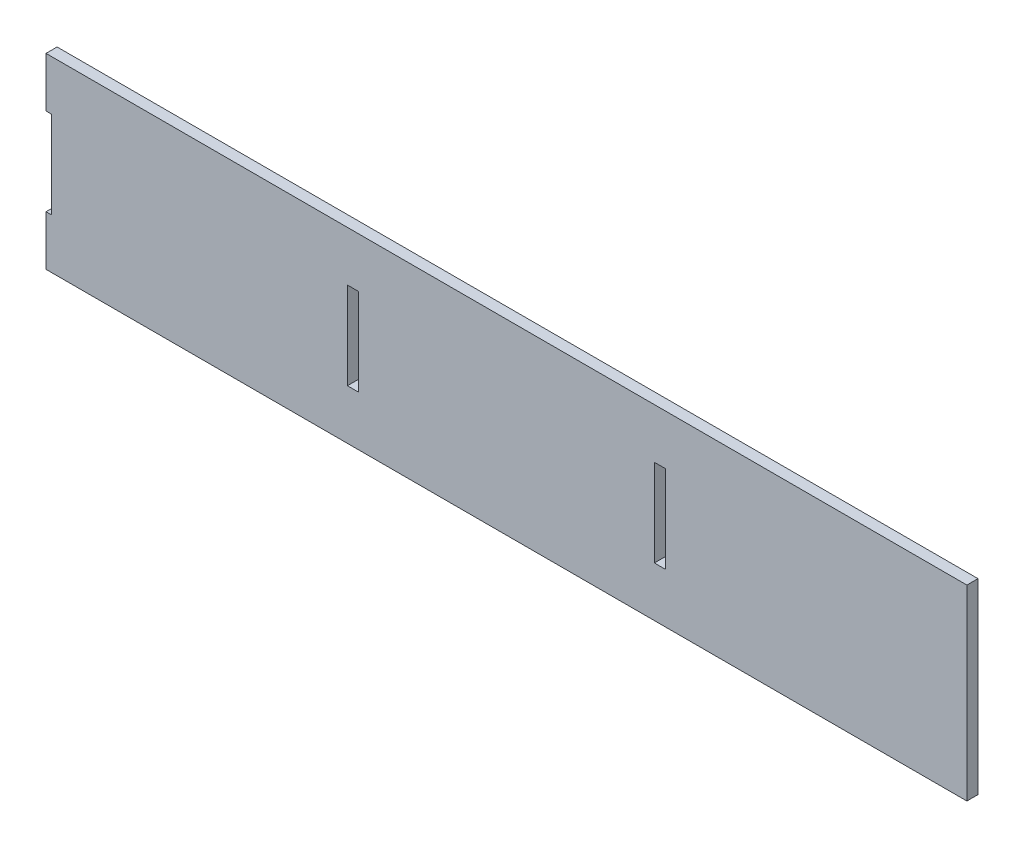
ISO-10303-21;
HEADER;
FILE_DESCRIPTION(('STEP AP214'),'2;1');
FILE_NAME('part.step','',(''),(''),'','','');
FILE_SCHEMA(('AUTOMOTIVE_DESIGN { 1 0 10303 214 1 1 1 1 }'));
ENDSEC;
DATA;
#1=APPLICATION_CONTEXT('core data for automotive mechanical design processes');
#2=APPLICATION_PROTOCOL_DEFINITION('international standard','automotive_design',2000,#1);
#3=PRODUCT_CONTEXT('',#1,'mechanical');
#4=PRODUCT('Part','Part','',(#3));
#5=PRODUCT_RELATED_PRODUCT_CATEGORY('part','',(#4));
#6=PRODUCT_DEFINITION_FORMATION('','',#4);
#7=PRODUCT_DEFINITION_CONTEXT('part definition',#1,'design');
#8=PRODUCT_DEFINITION('design','',#6,#7);
#9=PRODUCT_DEFINITION_SHAPE('','',#8);
#10=(LENGTH_UNIT() NAMED_UNIT(*) SI_UNIT(.MILLI.,.METRE.));
#11=(NAMED_UNIT(*) PLANE_ANGLE_UNIT() SI_UNIT($,.RADIAN.));
#12=(NAMED_UNIT(*) SI_UNIT($,.STERADIAN.) SOLID_ANGLE_UNIT());
#13=UNCERTAINTY_MEASURE_WITH_UNIT(LENGTH_MEASURE(1.E-05),#10,'distance_accuracy_value','');
#14=(GEOMETRIC_REPRESENTATION_CONTEXT(3) GLOBAL_UNCERTAINTY_ASSIGNED_CONTEXT((#13)) GLOBAL_UNIT_ASSIGNED_CONTEXT((#10,
#11,#12)) REPRESENTATION_CONTEXT('',''));
#15=CARTESIAN_POINT('',(0.,0.,0.));
#16=DIRECTION('',(0.,0.,1.));
#17=DIRECTION('',(1.,0.,0.));
#18=AXIS2_PLACEMENT_3D('',#15,#16,#17);
#19=CARTESIAN_POINT('',(0.,0.,0.));
#20=DIRECTION('',(1.,0.,0.));
#21=DIRECTION('',(0.,0.,-1.));
#22=AXIS2_PLACEMENT_3D('',#19,#20,#21);
#23=PLANE('',#22);
#24=DIRECTION('',(0.,-1.,-3.13176484537216E-13));
#25=VECTOR('',#24,1.);
#26=CARTESIAN_POINT('',(0.,1.92946796140626E-10,-616.096053398598));
#27=LINE('',#26,#25);
#28=CARTESIAN_POINT('',(0.,24.8992917013493,-616.09605339859));
#29=VERTEX_POINT('',#28);
#30=CARTESIAN_POINT('',(0.,10.6117917013481,-616.096053398647));
#31=VERTEX_POINT('',#30);
#32=EDGE_CURVE('E256',#29,#31,#27,.T.);
#33=ORIENTED_EDGE('',*,*,#32,.T.);
#34=DIRECTION('',(0.,0.,1.));
#35=VECTOR('',#34,1.);
#36=CARTESIAN_POINT('',(0.,10.6117917013481,0.));
#37=LINE('',#36,#35);
#38=CARTESIAN_POINT('',(0.,10.6117917013481,-612.921053398607));
#39=VERTEX_POINT('',#38);
#40=EDGE_CURVE('E245',#31,#39,#37,.T.);
#41=ORIENTED_EDGE('',*,*,#40,.T.);
#42=DIRECTION('',(0.,-1.,0.));
#43=VECTOR('',#42,1.);
#44=CARTESIAN_POINT('',(0.,0.,-612.921053398607));
#45=LINE('',#44,#43);
#46=CARTESIAN_POINT('',(0.,24.8992917013493,-612.921053398607));
#47=VERTEX_POINT('',#46);
#48=EDGE_CURVE('E263',#47,#39,#45,.T.);
#49=ORIENTED_EDGE('',*,*,#48,.F.);
#50=DIRECTION('',(0.,0.,1.));
#51=VECTOR('',#50,1.);
#52=CARTESIAN_POINT('',(0.,24.8992917013493,0.));
#53=LINE('',#52,#51);
#54=EDGE_CURVE('E259',#29,#47,#53,.T.);
#55=ORIENTED_EDGE('',*,*,#54,.F.);
#56=EDGE_LOOP('',(#33,#41,#49,#55));
#57=FACE_BOUND('',#56,.T.);
#58=ADVANCED_FACE('F35',(#57),#23,.F.);
#59=CARTESIAN_POINT('',(0.,-14.3433055427418,-612.921053398607));
#60=VERTEX_POINT('',#59);
#61=CARTESIAN_POINT('',(0.,-28.6308055427389,-612.921053398607));
#62=VERTEX_POINT('',#61);
#63=EDGE_CURVE('E262',#60,#62,#45,.T.);
#64=ORIENTED_EDGE('',*,*,#63,.F.);
#65=DIRECTION('',(0.,0.,-1.));
#66=VECTOR('',#65,1.);
#67=CARTESIAN_POINT('',(0.,-14.3433055427418,0.));
#68=LINE('',#67,#66);
#69=CARTESIAN_POINT('',(0.,-14.3433055427418,-616.096053398647));
#70=VERTEX_POINT('',#69);
#71=EDGE_CURVE('E236',#60,#70,#68,.T.);
#72=ORIENTED_EDGE('',*,*,#71,.T.);
#73=CARTESIAN_POINT('',(0.,-28.6308055427422,-616.096053398607));
#74=VERTEX_POINT('',#73);
#75=EDGE_CURVE('E248',#70,#74,#27,.T.);
#76=ORIENTED_EDGE('',*,*,#75,.T.);
#77=DIRECTION('',(0.,1.01843293203802E-12,1.));
#78=VECTOR('',#77,1.);
#79=CARTESIAN_POINT('',(0.,-28.6308055421147,2.91585552348664E-11));
#80=LINE('',#79,#78);
#81=EDGE_CURVE('E266',#74,#62,#80,.T.);
#82=ORIENTED_EDGE('',*,*,#81,.T.);
#83=EDGE_LOOP('',(#64,#72,#76,#82));
#84=FACE_BOUND('',#83,.T.);
#85=ADVANCED_FACE('F301',(#84),#23,.F.);
#86=CARTESIAN_POINT('',(317.149173056206,-28.6308055421147,2.91585552348664E-11));
#87=DIRECTION('',(0.,-1.,1.01843293203802E-12));
#88=DIRECTION('',(0.,-1.01843293203802E-12,-1.));
#89=AXIS2_PLACEMENT_3D('',#86,#87,#88);
#90=PLANE('',#89);
#91=DIRECTION('',(-1.,0.,0.));
#92=VECTOR('',#91,1.);
#93=CARTESIAN_POINT('',(317.149173056206,-28.6308055427422,-616.096053398607));
#94=LINE('',#93,#92);
#95=CARTESIAN_POINT('',(263.525,-28.6308055427374,-616.096053398647));
#96=VERTEX_POINT('',#95);
#97=EDGE_CURVE('E269',#96,#74,#94,.T.);
#98=ORIENTED_EDGE('',*,*,#97,.F.);
#99=DIRECTION('',(0.,1.01843293203802E-12,1.));
#100=VECTOR('',#99,1.);
#101=CARTESIAN_POINT('',(263.525,-28.6308055421147,2.91585552348664E-11));
#102=LINE('',#101,#100);
#103=CARTESIAN_POINT('',(263.525,-28.6308055427389,-612.921053398607));
#104=VERTEX_POINT('',#103);
#105=EDGE_CURVE('E252',#96,#104,#102,.T.);
#106=ORIENTED_EDGE('',*,*,#105,.T.);
#107=DIRECTION('',(-1.,0.,0.));
#108=VECTOR('',#107,1.);
#109=CARTESIAN_POINT('',(317.149173056206,-28.6308055427389,-612.921053398607));
#110=LINE('',#109,#108);
#111=EDGE_CURVE('E272',#104,#62,#110,.T.);
#112=ORIENTED_EDGE('',*,*,#111,.T.);
#113=ORIENTED_EDGE('',*,*,#81,.F.);
#114=EDGE_LOOP('',(#98,#106,#112,#113));
#115=FACE_BOUND('',#114,.T.);
#116=ADVANCED_FACE('F281',(#115),#90,.T.);
#117=CARTESIAN_POINT('',(317.149173056206,0.,-612.921053398607));
#118=DIRECTION('',(0.,0.,-1.));
#119=DIRECTION('',(-1.,0.,0.));
#120=AXIS2_PLACEMENT_3D('',#117,#118,#119);
#121=PLANE('',#120);
#122=DIRECTION('',(-1.,0.,0.));
#123=VECTOR('',#122,1.);
#124=CARTESIAN_POINT('',(317.149173056206,-14.3433055427418,-612.921053398607));
#125=LINE('',#124,#123);
#126=CARTESIAN_POINT('',(89.4291666666667,-14.3433055427418,-612.921053398607));
#127=VERTEX_POINT('',#126);
#128=CARTESIAN_POINT('',(86.2541666666667,-14.3433055427418,-612.921053398607));
#129=VERTEX_POINT('',#128);
#130=EDGE_CURVE('E212',#127,#129,#125,.T.);
#131=ORIENTED_EDGE('',*,*,#130,.T.);
#132=DIRECTION('',(0.,1.,0.));
#133=VECTOR('',#132,1.);
#134=CARTESIAN_POINT('',(86.2541666666667,0.,-612.921053398607));
#135=LINE('',#134,#133);
#136=CARTESIAN_POINT('',(86.2541666666667,10.6117917013481,-612.921053398607));
#137=VERTEX_POINT('',#136);
#138=EDGE_CURVE('E152',#129,#137,#135,.T.);
#139=ORIENTED_EDGE('',*,*,#138,.T.);
#140=DIRECTION('',(1.,0.,0.));
#141=VECTOR('',#140,1.);
#142=CARTESIAN_POINT('',(317.149173056206,10.6117917013481,-612.921053398607));
#143=LINE('',#142,#141);
#144=CARTESIAN_POINT('',(89.4291666666667,10.6117917013481,-612.921053398607));
#145=VERTEX_POINT('',#144);
#146=EDGE_CURVE('E217',#137,#145,#143,.T.);
#147=ORIENTED_EDGE('',*,*,#146,.T.);
#148=DIRECTION('',(0.,-1.,0.));
#149=VECTOR('',#148,1.);
#150=CARTESIAN_POINT('',(89.4291666666667,0.,-612.921053398607));
#151=LINE('',#150,#149);
#152=EDGE_CURVE('E214',#145,#127,#151,.T.);
#153=ORIENTED_EDGE('',*,*,#152,.T.);
#154=EDGE_LOOP('',(#131,#139,#147,#153));
#155=FACE_BOUND('',#154,.T.);
#156=DIRECTION('',(-1.,0.,0.));
#157=VECTOR('',#156,1.);
#158=CARTESIAN_POINT('',(317.149173056206,-14.3433055427418,-612.921053398607));
#159=LINE('',#158,#157);
#160=CARTESIAN_POINT('',(177.270833333333,-14.3433055427418,-612.921053398607));
#161=VERTEX_POINT('',#160);
#162=CARTESIAN_POINT('',(174.095833333333,-14.3433055427418,-612.921053398607));
#163=VERTEX_POINT('',#162);
#164=EDGE_CURVE('E178',#161,#163,#159,.T.);
#165=ORIENTED_EDGE('',*,*,#164,.T.);
#166=DIRECTION('',(0.,1.,0.));
#167=VECTOR('',#166,1.);
#168=CARTESIAN_POINT('',(174.095833333333,0.,-612.921053398607));
#169=LINE('',#168,#167);
#170=CARTESIAN_POINT('',(174.095833333333,10.6117917013481,-612.921053398607));
#171=VERTEX_POINT('',#170);
#172=EDGE_CURVE('E209',#163,#171,#169,.T.);
#173=ORIENTED_EDGE('',*,*,#172,.T.);
#174=DIRECTION('',(1.,0.,0.));
#175=VECTOR('',#174,1.);
#176=CARTESIAN_POINT('',(317.149173056206,10.6117917013481,-612.921053398607));
#177=LINE('',#176,#175);
#178=CARTESIAN_POINT('',(177.270833333333,10.6117917013481,-612.921053398607));
#179=VERTEX_POINT('',#178);
#180=EDGE_CURVE('E206',#171,#179,#177,.T.);
#181=ORIENTED_EDGE('',*,*,#180,.T.);
#182=DIRECTION('',(0.,-1.,0.));
#183=VECTOR('',#182,1.);
#184=CARTESIAN_POINT('',(177.270833333333,0.,-612.921053398607));
#185=LINE('',#184,#183);
#186=EDGE_CURVE('E203',#179,#161,#185,.T.);
#187=ORIENTED_EDGE('',*,*,#186,.T.);
#188=EDGE_LOOP('',(#165,#173,#181,#187));
#189=FACE_BOUND('',#188,.T.);
#190=ORIENTED_EDGE('',*,*,#48,.T.);
#191=DIRECTION('',(1.,0.,0.));
#192=VECTOR('',#191,1.);
#193=CARTESIAN_POINT('',(317.149173056206,10.6117917013481,-612.921053398607));
#194=LINE('',#193,#192);
#195=CARTESIAN_POINT('',(1.5875,10.6117917013481,-612.921053398607));
#196=VERTEX_POINT('',#195);
#197=EDGE_CURVE('E242',#39,#196,#194,.T.);
#198=ORIENTED_EDGE('',*,*,#197,.T.);
#199=DIRECTION('',(0.,-1.,0.));
#200=VECTOR('',#199,1.);
#201=CARTESIAN_POINT('',(1.58750000000002,0.,-612.921053398607));
#202=LINE('',#201,#200);
#203=CARTESIAN_POINT('',(1.5875,-14.3433055427418,-612.921053398607));
#204=VERTEX_POINT('',#203);
#205=EDGE_CURVE('E239',#196,#204,#202,.T.);
#206=ORIENTED_EDGE('',*,*,#205,.T.);
#207=DIRECTION('',(-1.,0.,0.));
#208=VECTOR('',#207,1.);
#209=CARTESIAN_POINT('',(317.149173056206,-14.3433055427418,-612.921053398607));
#210=LINE('',#209,#208);
#211=EDGE_CURVE('E231',#204,#60,#210,.T.);
#212=ORIENTED_EDGE('',*,*,#211,.T.);
#213=ORIENTED_EDGE('',*,*,#63,.T.);
#214=ORIENTED_EDGE('',*,*,#111,.F.);
#215=DIRECTION('',(0.,-1.,0.));
#216=VECTOR('',#215,1.);
#217=CARTESIAN_POINT('',(263.525,0.,-612.921053398607));
#218=LINE('',#217,#216);
#219=CARTESIAN_POINT('',(263.525,24.8992917013493,-612.921053398607));
#220=VERTEX_POINT('',#219);
#221=EDGE_CURVE('E249',#220,#104,#218,.T.);
#222=ORIENTED_EDGE('',*,*,#221,.F.);
#223=DIRECTION('',(-1.,0.,0.));
#224=VECTOR('',#223,1.);
#225=CARTESIAN_POINT('',(317.149173056206,24.8992917013493,-612.921053398607));
#226=LINE('',#225,#224);
#227=EDGE_CURVE('E275',#220,#47,#226,.T.);
#228=ORIENTED_EDGE('',*,*,#227,.T.);
#229=EDGE_LOOP('',(#190,#198,#206,#212,#213,#214,#222,#228));
#230=FACE_BOUND('',#229,.T.);
#231=ADVANCED_FACE('F298',(#155,#189,#230),#121,.F.);
#232=CARTESIAN_POINT('',(317.149173056206,24.8992917013493,0.));
#233=DIRECTION('',(0.,-1.,0.));
#234=DIRECTION('',(0.,0.,-1.));
#235=AXIS2_PLACEMENT_3D('',#232,#233,#234);
#236=PLANE('',#235);
#237=DIRECTION('',(0.,0.,1.));
#238=VECTOR('',#237,1.);
#239=CARTESIAN_POINT('',(263.525,24.8992917013493,0.));
#240=LINE('',#239,#238);
#241=CARTESIAN_POINT('',(263.525,24.8992917020167,-616.09605339581));
#242=VERTEX_POINT('',#241);
#243=EDGE_CURVE('E251',#242,#220,#240,.T.);
#244=ORIENTED_EDGE('',*,*,#243,.F.);
#245=DIRECTION('',(-1.,0.,0.));
#246=VECTOR('',#245,1.);
#247=CARTESIAN_POINT('',(317.149173056206,24.8992917013493,-616.09605339859));
#248=LINE('',#247,#246);
#249=EDGE_CURVE('E277',#242,#29,#248,.T.);
#250=ORIENTED_EDGE('',*,*,#249,.T.);
#251=ORIENTED_EDGE('',*,*,#54,.T.);
#252=ORIENTED_EDGE('',*,*,#227,.F.);
#253=EDGE_LOOP('',(#244,#250,#251,#252));
#254=FACE_BOUND('',#253,.T.);
#255=ADVANCED_FACE('F295',(#254),#236,.F.);
#256=CARTESIAN_POINT('',(317.149173056206,1.92946796140626E-10,-616.096053398598));
#257=DIRECTION('',(0.,3.13176484537216E-13,-1.));
#258=DIRECTION('',(0.,1.,3.13176484537216E-13));
#259=AXIS2_PLACEMENT_3D('',#256,#257,#258);
#260=PLANE('',#259);
#261=DIRECTION('',(0.,-1.,0.));
#262=VECTOR('',#261,1.);
#263=CARTESIAN_POINT('',(86.2541666666667,10.6117917013481,-616.096053398647));
#264=LINE('',#263,#262);
#265=CARTESIAN_POINT('',(86.2541666666667,10.6117917013481,-616.096053398647));
#266=VERTEX_POINT('',#265);
#267=CARTESIAN_POINT('',(86.2541666666667,-14.3433055427418,-616.096053398647));
#268=VERTEX_POINT('',#267);
#269=EDGE_CURVE('E149',#266,#268,#264,.T.);
#270=ORIENTED_EDGE('',*,*,#269,.T.);
#271=DIRECTION('',(1.,0.,0.));
#272=VECTOR('',#271,1.);
#273=CARTESIAN_POINT('',(86.2541666666667,-14.3433055427418,-616.096053398647));
#274=LINE('',#273,#272);
#275=CARTESIAN_POINT('',(89.4291666666666,-14.3433055427418,-616.096053398603));
#276=VERTEX_POINT('',#275);
#277=EDGE_CURVE('E159',#268,#276,#274,.T.);
#278=ORIENTED_EDGE('',*,*,#277,.T.);
#279=DIRECTION('',(0.,1.,0.));
#280=VECTOR('',#279,1.);
#281=CARTESIAN_POINT('',(89.4291666666667,10.6117917013481,-616.096053398647));
#282=LINE('',#281,#280);
#283=CARTESIAN_POINT('',(89.4291666666667,10.6117917013481,-616.096053398647));
#284=VERTEX_POINT('',#283);
#285=EDGE_CURVE('E164',#276,#284,#282,.T.);
#286=ORIENTED_EDGE('',*,*,#285,.T.);
#287=DIRECTION('',(-1.,0.,0.));
#288=VECTOR('',#287,1.);
#289=CARTESIAN_POINT('',(86.2541666666667,10.6117917013481,-616.096053398647));
#290=LINE('',#289,#288);
#291=EDGE_CURVE('E155',#284,#266,#290,.T.);
#292=ORIENTED_EDGE('',*,*,#291,.T.);
#293=EDGE_LOOP('',(#270,#278,#286,#292));
#294=FACE_BOUND('',#293,.T.);
#295=DIRECTION('',(0.,-1.,0.));
#296=VECTOR('',#295,1.);
#297=CARTESIAN_POINT('',(174.095833333333,10.6117917013481,-616.096053398647));
#298=LINE('',#297,#296);
#299=CARTESIAN_POINT('',(174.095833333333,10.6117917013481,-616.096053398647));
#300=VERTEX_POINT('',#299);
#301=CARTESIAN_POINT('',(174.095833333333,-14.3433055427418,-616.096053398647));
#302=VERTEX_POINT('',#301);
#303=EDGE_CURVE('E183',#300,#302,#298,.T.);
#304=ORIENTED_EDGE('',*,*,#303,.T.);
#305=DIRECTION('',(1.,0.,0.));
#306=VECTOR('',#305,1.);
#307=CARTESIAN_POINT('',(174.095833333333,-14.3433055427418,-616.096053398647));
#308=LINE('',#307,#306);
#309=CARTESIAN_POINT('',(177.270833333333,-14.3433055427418,-616.096053398603));
#310=VERTEX_POINT('',#309);
#311=EDGE_CURVE('E186',#302,#310,#308,.T.);
#312=ORIENTED_EDGE('',*,*,#311,.T.);
#313=DIRECTION('',(0.,1.,0.));
#314=VECTOR('',#313,1.);
#315=CARTESIAN_POINT('',(177.270833333333,10.6117917013481,-616.096053398647));
#316=LINE('',#315,#314);
#317=CARTESIAN_POINT('',(177.270833333333,10.6117917013481,-616.096053398647));
#318=VERTEX_POINT('',#317);
#319=EDGE_CURVE('E189',#310,#318,#316,.T.);
#320=ORIENTED_EDGE('',*,*,#319,.T.);
#321=DIRECTION('',(-1.,0.,0.));
#322=VECTOR('',#321,1.);
#323=CARTESIAN_POINT('',(174.095833333333,10.6117917013481,-616.096053398647));
#324=LINE('',#323,#322);
#325=EDGE_CURVE('E192',#318,#300,#324,.T.);
#326=ORIENTED_EDGE('',*,*,#325,.T.);
#327=EDGE_LOOP('',(#304,#312,#320,#326));
#328=FACE_BOUND('',#327,.T.);
#329=DIRECTION('',(-1.,0.,0.));
#330=VECTOR('',#329,1.);
#331=CARTESIAN_POINT('',(-1.5875,10.6117917013481,-616.096053398647));
#332=LINE('',#331,#330);
#333=CARTESIAN_POINT('',(1.5875,10.6117917013481,-616.096053398647));
#334=VERTEX_POINT('',#333);
#335=EDGE_CURVE('E224',#334,#31,#332,.T.);
#336=ORIENTED_EDGE('',*,*,#335,.T.);
#337=ORIENTED_EDGE('',*,*,#32,.F.);
#338=ORIENTED_EDGE('',*,*,#249,.F.);
#339=DIRECTION('',(0.,-1.,-3.13176484537216E-13));
#340=VECTOR('',#339,1.);
#341=CARTESIAN_POINT('',(263.525,1.92946796140626E-10,-616.096053398598));
#342=LINE('',#341,#340);
#343=EDGE_CURVE('E43',#242,#96,#342,.T.);
#344=ORIENTED_EDGE('',*,*,#343,.T.);
#345=ORIENTED_EDGE('',*,*,#97,.T.);
#346=ORIENTED_EDGE('',*,*,#75,.F.);
#347=DIRECTION('',(-1.,0.,0.));
#348=VECTOR('',#347,1.);
#349=CARTESIAN_POINT('',(317.149173056206,-14.3433055427418,-616.096053398603));
#350=LINE('',#349,#348);
#351=CARTESIAN_POINT('',(1.58750000000002,-14.3433055427418,-616.096053398603));
#352=VERTEX_POINT('',#351);
#353=EDGE_CURVE('E11',#352,#70,#350,.T.);
#354=ORIENTED_EDGE('',*,*,#353,.F.);
#355=DIRECTION('',(0.,1.,0.));
#356=VECTOR('',#355,1.);
#357=CARTESIAN_POINT('',(1.5875,10.6117917013481,-616.096053398647));
#358=LINE('',#357,#356);
#359=EDGE_CURVE('E221',#352,#334,#358,.T.);
#360=ORIENTED_EDGE('',*,*,#359,.T.);
#361=EDGE_LOOP('',(#336,#337,#338,#344,#345,#346,#354,#360));
#362=FACE_BOUND('',#361,.T.);
#363=ADVANCED_FACE('F37',(#294,#328,#362),#260,.T.);
#364=CARTESIAN_POINT('',(263.525,0.,0.));
#365=DIRECTION('',(1.,0.,0.));
#366=DIRECTION('',(0.,0.,-1.));
#367=AXIS2_PLACEMENT_3D('',#364,#365,#366);
#368=PLANE('',#367);
#369=ORIENTED_EDGE('',*,*,#243,.T.);
#370=ORIENTED_EDGE('',*,*,#221,.T.);
#371=ORIENTED_EDGE('',*,*,#105,.F.);
#372=ORIENTED_EDGE('',*,*,#343,.F.);
#373=EDGE_LOOP('',(#369,#370,#371,#372));
#374=FACE_BOUND('',#373,.T.);
#375=ADVANCED_FACE('F285',(#374),#368,.T.);
#376=CARTESIAN_POINT('',(-1.5875,10.6117917013481,-616.096053398647));
#377=DIRECTION('',(0.,1.,0.));
#378=DIRECTION('',(0.,0.,1.));
#379=AXIS2_PLACEMENT_3D('',#376,#377,#378);
#380=PLANE('',#379);
#381=ORIENTED_EDGE('',*,*,#335,.F.);
#382=DIRECTION('',(0.,0.,1.));
#383=VECTOR('',#382,1.);
#384=CARTESIAN_POINT('',(1.5875,10.6117917013481,-616.096053398647));
#385=LINE('',#384,#383);
#386=EDGE_CURVE('E228',#334,#196,#385,.T.);
#387=ORIENTED_EDGE('',*,*,#386,.T.);
#388=ORIENTED_EDGE('',*,*,#197,.F.);
#389=ORIENTED_EDGE('',*,*,#40,.F.);
#390=EDGE_LOOP('',(#381,#387,#388,#389));
#391=FACE_BOUND('',#390,.T.);
#392=ADVANCED_FACE('F310',(#391),#380,.F.);
#393=CARTESIAN_POINT('',(1.5875,10.6117917013481,-616.096053398647));
#394=DIRECTION('',(1.,0.,0.));
#395=DIRECTION('',(0.,1.,0.));
#396=AXIS2_PLACEMENT_3D('',#393,#394,#395);
#397=PLANE('',#396);
#398=ORIENTED_EDGE('',*,*,#386,.F.);
#399=ORIENTED_EDGE('',*,*,#359,.F.);
#400=DIRECTION('',(0.,0.,1.));
#401=VECTOR('',#400,1.);
#402=CARTESIAN_POINT('',(1.5875,-14.3433055427418,-616.096053398647));
#403=LINE('',#402,#401);
#404=EDGE_CURVE('E227',#352,#204,#403,.T.);
#405=ORIENTED_EDGE('',*,*,#404,.T.);
#406=ORIENTED_EDGE('',*,*,#205,.F.);
#407=EDGE_LOOP('',(#398,#399,#405,#406));
#408=FACE_BOUND('',#407,.T.);
#409=ADVANCED_FACE('F307',(#408),#397,.F.);
#410=CARTESIAN_POINT('',(-1.5875,-14.3433055427418,-616.096053398647));
#411=DIRECTION('',(0.,-1.,0.));
#412=DIRECTION('',(0.,0.,-1.));
#413=AXIS2_PLACEMENT_3D('',#410,#411,#412);
#414=PLANE('',#413);
#415=ORIENTED_EDGE('',*,*,#211,.F.);
#416=ORIENTED_EDGE('',*,*,#404,.F.);
#417=ORIENTED_EDGE('',*,*,#353,.T.);
#418=ORIENTED_EDGE('',*,*,#71,.F.);
#419=EDGE_LOOP('',(#415,#416,#417,#418));
#420=FACE_BOUND('',#419,.T.);
#421=ADVANCED_FACE('F305',(#420),#414,.F.);
#422=CARTESIAN_POINT('',(174.095833333333,10.6117917013481,-616.096053398647));
#423=DIRECTION('',(-1.,0.,0.));
#424=DIRECTION('',(0.,-1.,0.));
#425=AXIS2_PLACEMENT_3D('',#422,#423,#424);
#426=PLANE('',#425);
#427=DIRECTION('',(0.,0.,1.));
#428=VECTOR('',#427,1.);
#429=CARTESIAN_POINT('',(174.095833333333,-14.3433055427418,-616.096053398647));
#430=LINE('',#429,#428);
#431=EDGE_CURVE('E58',#302,#163,#430,.T.);
#432=ORIENTED_EDGE('',*,*,#431,.F.);
#433=ORIENTED_EDGE('',*,*,#303,.F.);
#434=DIRECTION('',(0.,0.,1.));
#435=VECTOR('',#434,1.);
#436=CARTESIAN_POINT('',(174.095833333333,10.6117917013481,-616.096053398647));
#437=LINE('',#436,#435);
#438=EDGE_CURVE('E168',#300,#171,#437,.T.);
#439=ORIENTED_EDGE('',*,*,#438,.T.);
#440=ORIENTED_EDGE('',*,*,#172,.F.);
#441=EDGE_LOOP('',(#432,#433,#439,#440));
#442=FACE_BOUND('',#441,.T.);
#443=ADVANCED_FACE('F340',(#442),#426,.F.);
#444=CARTESIAN_POINT('',(174.095833333333,10.6117917013481,-616.096053398647));
#445=DIRECTION('',(0.,1.,0.));
#446=DIRECTION('',(0.,0.,1.));
#447=AXIS2_PLACEMENT_3D('',#444,#445,#446);
#448=PLANE('',#447);
#449=ORIENTED_EDGE('',*,*,#438,.F.);
#450=ORIENTED_EDGE('',*,*,#325,.F.);
#451=DIRECTION('',(0.,0.,1.));
#452=VECTOR('',#451,1.);
#453=CARTESIAN_POINT('',(177.270833333333,10.6117917013481,-616.096053398647));
#454=LINE('',#453,#452);
#455=EDGE_CURVE('E171',#318,#179,#454,.T.);
#456=ORIENTED_EDGE('',*,*,#455,.T.);
#457=ORIENTED_EDGE('',*,*,#180,.F.);
#458=EDGE_LOOP('',(#449,#450,#456,#457));
#459=FACE_BOUND('',#458,.T.);
#460=ADVANCED_FACE('F346',(#459),#448,.F.);
#461=CARTESIAN_POINT('',(177.270833333333,10.6117917013481,-616.096053398647));
#462=DIRECTION('',(1.,0.,0.));
#463=DIRECTION('',(0.,1.,0.));
#464=AXIS2_PLACEMENT_3D('',#461,#462,#463);
#465=PLANE('',#464);
#466=ORIENTED_EDGE('',*,*,#455,.F.);
#467=ORIENTED_EDGE('',*,*,#319,.F.);
#468=DIRECTION('',(0.,0.,1.));
#469=VECTOR('',#468,1.);
#470=CARTESIAN_POINT('',(177.270833333333,-14.3433055427418,-616.096053398647));
#471=LINE('',#470,#469);
#472=EDGE_CURVE('E197',#310,#161,#471,.T.);
#473=ORIENTED_EDGE('',*,*,#472,.T.);
#474=ORIENTED_EDGE('',*,*,#186,.F.);
#475=EDGE_LOOP('',(#466,#467,#473,#474));
#476=FACE_BOUND('',#475,.T.);
#477=ADVANCED_FACE('F351',(#476),#465,.F.);
#478=CARTESIAN_POINT('',(174.095833333333,-14.3433055427418,-616.096053398647));
#479=DIRECTION('',(0.,-1.,0.));
#480=DIRECTION('',(0.,0.,-1.));
#481=AXIS2_PLACEMENT_3D('',#478,#479,#480);
#482=PLANE('',#481);
#483=ORIENTED_EDGE('',*,*,#472,.F.);
#484=ORIENTED_EDGE('',*,*,#311,.F.);
#485=ORIENTED_EDGE('',*,*,#431,.T.);
#486=ORIENTED_EDGE('',*,*,#164,.F.);
#487=EDGE_LOOP('',(#483,#484,#485,#486));
#488=FACE_BOUND('',#487,.T.);
#489=ADVANCED_FACE('F356',(#488),#482,.F.);
#490=CARTESIAN_POINT('',(86.2541666666667,10.6117917013481,-616.096053398647));
#491=DIRECTION('',(-1.,0.,0.));
#492=DIRECTION('',(0.,-1.,0.));
#493=AXIS2_PLACEMENT_3D('',#490,#491,#492);
#494=PLANE('',#493);
#495=DIRECTION('',(0.,0.,1.));
#496=VECTOR('',#495,1.);
#497=CARTESIAN_POINT('',(86.2541666666667,-14.3433055427418,-616.096053398647));
#498=LINE('',#497,#496);
#499=EDGE_CURVE('E50',#268,#129,#498,.T.);
#500=ORIENTED_EDGE('',*,*,#499,.F.);
#501=ORIENTED_EDGE('',*,*,#269,.F.);
#502=DIRECTION('',(0.,0.,1.));
#503=VECTOR('',#502,1.);
#504=CARTESIAN_POINT('',(86.2541666666667,10.6117917013481,-616.096053398647));
#505=LINE('',#504,#503);
#506=EDGE_CURVE('E176',#266,#137,#505,.T.);
#507=ORIENTED_EDGE('',*,*,#506,.T.);
#508=ORIENTED_EDGE('',*,*,#138,.F.);
#509=EDGE_LOOP('',(#500,#501,#507,#508));
#510=FACE_BOUND('',#509,.T.);
#511=ADVANCED_FACE('F146',(#510),#494,.F.);
#512=CARTESIAN_POINT('',(86.2541666666667,10.6117917013481,-616.096053398647));
#513=DIRECTION('',(0.,1.,0.));
#514=DIRECTION('',(0.,0.,1.));
#515=AXIS2_PLACEMENT_3D('',#512,#513,#514);
#516=PLANE('',#515);
#517=ORIENTED_EDGE('',*,*,#506,.F.);
#518=ORIENTED_EDGE('',*,*,#291,.F.);
#519=DIRECTION('',(0.,0.,1.));
#520=VECTOR('',#519,1.);
#521=CARTESIAN_POINT('',(89.4291666666667,10.6117917013481,-616.096053398647));
#522=LINE('',#521,#520);
#523=EDGE_CURVE('E179',#284,#145,#522,.T.);
#524=ORIENTED_EDGE('',*,*,#523,.T.);
#525=ORIENTED_EDGE('',*,*,#146,.F.);
#526=EDGE_LOOP('',(#517,#518,#524,#525));
#527=FACE_BOUND('',#526,.T.);
#528=ADVANCED_FACE('F368',(#527),#516,.F.);
#529=CARTESIAN_POINT('',(89.4291666666667,10.6117917013481,-616.096053398647));
#530=DIRECTION('',(1.,0.,0.));
#531=DIRECTION('',(0.,1.,0.));
#532=AXIS2_PLACEMENT_3D('',#529,#530,#531);
#533=PLANE('',#532);
#534=ORIENTED_EDGE('',*,*,#523,.F.);
#535=ORIENTED_EDGE('',*,*,#285,.F.);
#536=DIRECTION('',(0.,0.,1.));
#537=VECTOR('',#536,1.);
#538=CARTESIAN_POINT('',(89.4291666666667,-14.3433055427418,-616.096053398647));
#539=LINE('',#538,#537);
#540=EDGE_CURVE('E154',#276,#127,#539,.T.);
#541=ORIENTED_EDGE('',*,*,#540,.T.);
#542=ORIENTED_EDGE('',*,*,#152,.F.);
#543=EDGE_LOOP('',(#534,#535,#541,#542));
#544=FACE_BOUND('',#543,.T.);
#545=ADVANCED_FACE('F371',(#544),#533,.F.);
#546=CARTESIAN_POINT('',(86.2541666666667,-14.3433055427418,-616.096053398647));
#547=DIRECTION('',(0.,-1.,0.));
#548=DIRECTION('',(0.,0.,-1.));
#549=AXIS2_PLACEMENT_3D('',#546,#547,#548);
#550=PLANE('',#549);
#551=ORIENTED_EDGE('',*,*,#540,.F.);
#552=ORIENTED_EDGE('',*,*,#277,.F.);
#553=ORIENTED_EDGE('',*,*,#499,.T.);
#554=ORIENTED_EDGE('',*,*,#130,.F.);
#555=EDGE_LOOP('',(#551,#552,#553,#554));
#556=FACE_BOUND('',#555,.T.);
#557=ADVANCED_FACE('F160',(#556),#550,.F.);
#558=CLOSED_SHELL('',(#58,#85,#116,#231,#255,#363,#375,#392,#409,#421,#443,#460,#477,#489,#511,
#528,#545,#557));
#559=MANIFOLD_SOLID_BREP('B2',#558);
#560=ADVANCED_BREP_SHAPE_REPRESENTATION('',(#18,#559),#14);
#561=SHAPE_DEFINITION_REPRESENTATION(#9,#560);
ENDSEC;
END-ISO-10303-21;
